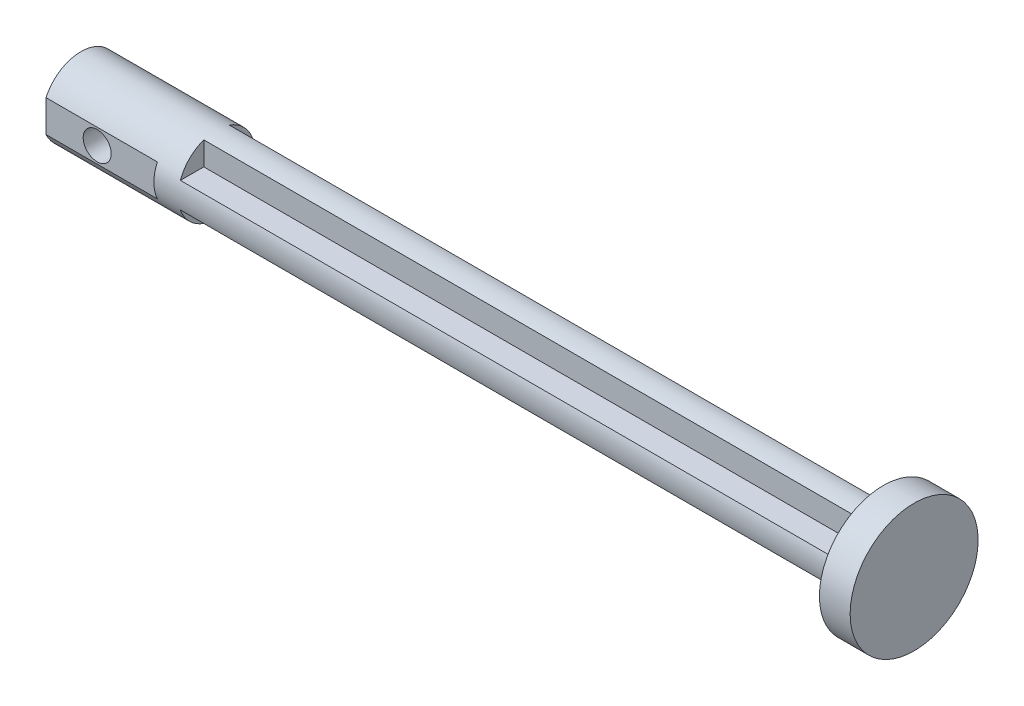
ISO-10303-21;
HEADER;
FILE_DESCRIPTION(('STEP AP214'),'2;1');
FILE_NAME('part.step','',(''),(''),'','','');
FILE_SCHEMA(('AUTOMOTIVE_DESIGN { 1 0 10303 214 1 1 1 1 }'));
ENDSEC;
DATA;
#1=APPLICATION_CONTEXT('core data for automotive mechanical design processes');
#2=APPLICATION_PROTOCOL_DEFINITION('international standard','automotive_design',2000,#1);
#3=PRODUCT_CONTEXT('',#1,'mechanical');
#4=PRODUCT('Part','Part','',(#3));
#5=PRODUCT_RELATED_PRODUCT_CATEGORY('part','',(#4));
#6=PRODUCT_DEFINITION_FORMATION('','',#4);
#7=PRODUCT_DEFINITION_CONTEXT('part definition',#1,'design');
#8=PRODUCT_DEFINITION('design','',#6,#7);
#9=PRODUCT_DEFINITION_SHAPE('','',#8);
#10=(LENGTH_UNIT() NAMED_UNIT(*) SI_UNIT(.MILLI.,.METRE.));
#11=(NAMED_UNIT(*) PLANE_ANGLE_UNIT() SI_UNIT($,.RADIAN.));
#12=(NAMED_UNIT(*) SI_UNIT($,.STERADIAN.) SOLID_ANGLE_UNIT());
#13=UNCERTAINTY_MEASURE_WITH_UNIT(LENGTH_MEASURE(1.E-05),#10,'distance_accuracy_value','');
#14=(GEOMETRIC_REPRESENTATION_CONTEXT(3) GLOBAL_UNCERTAINTY_ASSIGNED_CONTEXT((#13)) GLOBAL_UNIT_ASSIGNED_CONTEXT((#10,
#11,#12)) REPRESENTATION_CONTEXT('',''));
#15=CARTESIAN_POINT('',(0.,0.,0.));
#16=DIRECTION('',(0.,0.,1.));
#17=DIRECTION('',(1.,0.,0.));
#18=AXIS2_PLACEMENT_3D('',#15,#16,#17);
#19=CARTESIAN_POINT('',(13.462,0.,0.));
#20=DIRECTION('',(1.,0.,0.));
#21=DIRECTION('',(0.,0.,-1.));
#22=AXIS2_PLACEMENT_3D('',#19,#20,#21);
#23=PLANE('',#22);
#24=DIRECTION('',(0.,1.,0.));
#25=VECTOR('',#24,1.);
#26=CARTESIAN_POINT('',(13.462,1.27,-1.27));
#27=LINE('',#26,#25);
#28=CARTESIAN_POINT('',(13.462,1.27,-1.27));
#29=VERTEX_POINT('',#28);
#30=CARTESIAN_POINT('',(13.462,3.59210244842766,-1.27));
#31=VERTEX_POINT('',#30);
#32=EDGE_CURVE('E57',#29,#31,#27,.T.);
#33=ORIENTED_EDGE('',*,*,#32,.F.);
#34=DIRECTION('',(0.,0.,1.));
#35=VECTOR('',#34,1.);
#36=CARTESIAN_POINT('',(13.462,1.27,-3.59210244842766));
#37=LINE('',#36,#35);
#38=CARTESIAN_POINT('',(13.462,1.27,-3.59210244842766));
#39=VERTEX_POINT('',#38);
#40=EDGE_CURVE('E171',#39,#29,#37,.T.);
#41=ORIENTED_EDGE('',*,*,#40,.F.);
#42=CARTESIAN_POINT('',(13.462,0.,0.));
#43=DIRECTION('',(1.,0.,0.));
#44=DIRECTION('',(0.,0.,-1.));
#45=AXIS2_PLACEMENT_3D('',#42,#43,#44);
#46=CIRCLE('',#45,3.81);
#47=EDGE_CURVE('E11',#39,#31,#46,.T.);
#48=ORIENTED_EDGE('',*,*,#47,.T.);
#49=EDGE_LOOP('',(#33,#41,#48));
#50=FACE_BOUND('',#49,.T.);
#51=ADVANCED_FACE('F32',(#50),#23,.T.);
#52=DIRECTION('',(0.,0.,-1.));
#53=VECTOR('',#52,1.);
#54=CARTESIAN_POINT('',(13.462,-1.27,-1.27));
#55=LINE('',#54,#53);
#56=CARTESIAN_POINT('',(13.462,-1.27,-1.27));
#57=VERTEX_POINT('',#56);
#58=CARTESIAN_POINT('',(13.462,-1.27,-3.59210244842766));
#59=VERTEX_POINT('',#58);
#60=EDGE_CURVE('E184',#57,#59,#55,.T.);
#61=ORIENTED_EDGE('',*,*,#60,.F.);
#62=DIRECTION('',(0.,1.,0.));
#63=VECTOR('',#62,1.);
#64=CARTESIAN_POINT('',(13.462,-3.59210244842766,-1.27));
#65=LINE('',#64,#63);
#66=CARTESIAN_POINT('',(13.462,-3.59210244842766,-1.27));
#67=VERTEX_POINT('',#66);
#68=EDGE_CURVE('E190',#67,#57,#65,.T.);
#69=ORIENTED_EDGE('',*,*,#68,.F.);
#70=EDGE_CURVE('E258',#67,#59,#46,.T.);
#71=ORIENTED_EDGE('',*,*,#70,.T.);
#72=EDGE_LOOP('',(#61,#69,#71));
#73=FACE_BOUND('',#72,.T.);
#74=ADVANCED_FACE('F289',(#73),#23,.T.);
#75=DIRECTION('',(0.,-1.,0.));
#76=VECTOR('',#75,1.);
#77=CARTESIAN_POINT('',(13.462,-1.27,1.27));
#78=LINE('',#77,#76);
#79=CARTESIAN_POINT('',(13.462,-1.27,1.27));
#80=VERTEX_POINT('',#79);
#81=CARTESIAN_POINT('',(13.462,-3.59210244842766,1.27));
#82=VERTEX_POINT('',#81);
#83=EDGE_CURVE('E203',#80,#82,#78,.T.);
#84=ORIENTED_EDGE('',*,*,#83,.F.);
#85=DIRECTION('',(0.,0.,-1.));
#86=VECTOR('',#85,1.);
#87=CARTESIAN_POINT('',(13.462,-1.27,3.59210244842766));
#88=LINE('',#87,#86);
#89=CARTESIAN_POINT('',(13.462,-1.27,3.59210244842766));
#90=VERTEX_POINT('',#89);
#91=EDGE_CURVE('E209',#90,#80,#88,.T.);
#92=ORIENTED_EDGE('',*,*,#91,.F.);
#93=EDGE_CURVE('E267',#90,#82,#46,.T.);
#94=ORIENTED_EDGE('',*,*,#93,.T.);
#95=EDGE_LOOP('',(#84,#92,#94));
#96=FACE_BOUND('',#95,.T.);
#97=ADVANCED_FACE('F295',(#96),#23,.T.);
#98=CARTESIAN_POINT('',(13.462,0.,0.));
#99=DIRECTION('',(-1.,0.,0.));
#100=DIRECTION('',(0.,0.,1.));
#101=AXIS2_PLACEMENT_3D('',#98,#99,#100);
#102=CYLINDRICAL_SURFACE('',#101,3.81);
#103=ORIENTED_EDGE('',*,*,#47,.F.);
#104=DIRECTION('',(-1.,0.,0.));
#105=VECTOR('',#104,1.);
#106=CARTESIAN_POINT('',(90.405307345283,1.27,-3.59210244842766));
#107=LINE('',#106,#105);
#108=CARTESIAN_POINT('',(79.629,1.27,-3.59210244842766));
#109=VERTEX_POINT('',#108);
#110=EDGE_CURVE('E174',#109,#39,#107,.T.);
#111=ORIENTED_EDGE('',*,*,#110,.F.);
#112=CARTESIAN_POINT('',(79.629,0.,0.));
#113=DIRECTION('',(1.,0.,0.));
#114=DIRECTION('',(0.,0.,-1.));
#115=AXIS2_PLACEMENT_3D('',#112,#113,#114);
#116=CIRCLE('',#115,3.81);
#117=CARTESIAN_POINT('',(79.629,-1.27,-3.59210244842766));
#118=VERTEX_POINT('',#117);
#119=EDGE_CURVE('E217',#118,#109,#116,.T.);
#120=ORIENTED_EDGE('',*,*,#119,.F.);
#121=DIRECTION('',(-1.,0.,0.));
#122=VECTOR('',#121,1.);
#123=CARTESIAN_POINT('',(90.405307345283,-1.27,-3.59210244842766));
#124=LINE('',#123,#122);
#125=EDGE_CURVE('E179',#118,#59,#124,.T.);
#126=ORIENTED_EDGE('',*,*,#125,.T.);
#127=ORIENTED_EDGE('',*,*,#70,.F.);
#128=DIRECTION('',(-1.,0.,0.));
#129=VECTOR('',#128,1.);
#130=CARTESIAN_POINT('',(90.405307345283,-3.59210244842766,-1.27));
#131=LINE('',#130,#129);
#132=CARTESIAN_POINT('',(79.629,-3.59210244842766,-1.27));
#133=VERTEX_POINT('',#132);
#134=EDGE_CURVE('E193',#133,#67,#131,.T.);
#135=ORIENTED_EDGE('',*,*,#134,.F.);
#136=CARTESIAN_POINT('',(79.629,0.,0.));
#137=DIRECTION('',(1.,0.,0.));
#138=DIRECTION('',(0.,0.,-1.));
#139=AXIS2_PLACEMENT_3D('',#136,#137,#138);
#140=CIRCLE('',#139,3.81);
#141=CARTESIAN_POINT('',(79.629,-3.59210244842766,1.27));
#142=VERTEX_POINT('',#141);
#143=EDGE_CURVE('E226',#142,#133,#140,.T.);
#144=ORIENTED_EDGE('',*,*,#143,.F.);
#145=DIRECTION('',(-1.,0.,0.));
#146=VECTOR('',#145,1.);
#147=CARTESIAN_POINT('',(90.405307345283,-3.59210244842766,1.27));
#148=LINE('',#147,#146);
#149=EDGE_CURVE('E198',#142,#82,#148,.T.);
#150=ORIENTED_EDGE('',*,*,#149,.T.);
#151=ORIENTED_EDGE('',*,*,#93,.F.);
#152=DIRECTION('',(-1.,0.,0.));
#153=VECTOR('',#152,1.);
#154=CARTESIAN_POINT('',(90.405307345283,-1.27,3.59210244842766));
#155=LINE('',#154,#153);
#156=CARTESIAN_POINT('',(79.629,-1.27,3.59210244842766));
#157=VERTEX_POINT('',#156);
#158=EDGE_CURVE('E321',#157,#90,#155,.T.);
#159=ORIENTED_EDGE('',*,*,#158,.F.);
#160=CARTESIAN_POINT('',(79.629,0.,0.));
#161=DIRECTION('',(1.,0.,0.));
#162=DIRECTION('',(0.,0.,-1.));
#163=AXIS2_PLACEMENT_3D('',#160,#161,#162);
#164=CIRCLE('',#163,3.81);
#165=CARTESIAN_POINT('',(79.629,1.27,3.59210244842766));
#166=VERTEX_POINT('',#165);
#167=EDGE_CURVE('E235',#166,#157,#164,.T.);
#168=ORIENTED_EDGE('',*,*,#167,.F.);
#169=DIRECTION('',(-1.,0.,0.));
#170=VECTOR('',#169,1.);
#171=CARTESIAN_POINT('',(90.405307345283,1.27,3.59210244842766));
#172=LINE('',#171,#170);
#173=CARTESIAN_POINT('',(13.462,1.27,3.59210244842766));
#174=VERTEX_POINT('',#173);
#175=EDGE_CURVE('E322',#166,#174,#172,.T.);
#176=ORIENTED_EDGE('',*,*,#175,.T.);
#177=CARTESIAN_POINT('',(13.462,3.59210244842766,1.27));
#178=VERTEX_POINT('',#177);
#179=EDGE_CURVE('E42',#178,#174,#46,.T.);
#180=ORIENTED_EDGE('',*,*,#179,.F.);
#181=DIRECTION('',(-1.,0.,0.));
#182=VECTOR('',#181,1.);
#183=CARTESIAN_POINT('',(90.405307345283,3.59210244842766,1.27));
#184=LINE('',#183,#182);
#185=CARTESIAN_POINT('',(79.629,3.59210244842766,1.27));
#186=VERTEX_POINT('',#185);
#187=EDGE_CURVE('E271',#186,#178,#184,.T.);
#188=ORIENTED_EDGE('',*,*,#187,.F.);
#189=CARTESIAN_POINT('',(79.629,0.,0.));
#190=DIRECTION('',(1.,0.,0.));
#191=DIRECTION('',(0.,0.,-1.));
#192=AXIS2_PLACEMENT_3D('',#189,#190,#191);
#193=CIRCLE('',#192,3.81);
#194=CARTESIAN_POINT('',(79.629,3.59210244842766,-1.27));
#195=VERTEX_POINT('',#194);
#196=EDGE_CURVE('E244',#195,#186,#193,.T.);
#197=ORIENTED_EDGE('',*,*,#196,.F.);
#198=DIRECTION('',(-1.,0.,0.));
#199=VECTOR('',#198,1.);
#200=CARTESIAN_POINT('',(90.405307345283,3.59210244842766,-1.27));
#201=LINE('',#200,#199);
#202=EDGE_CURVE('E157',#195,#31,#201,.T.);
#203=ORIENTED_EDGE('',*,*,#202,.T.);
#204=EDGE_LOOP('',(#103,#111,#120,#126,#127,#135,#144,#150,#151,#159,#168,#176,#180,#188,#197,#203));
#205=FACE_BOUND('',#204,.T.);
#206=CARTESIAN_POINT('',(11.049,0.,0.));
#207=DIRECTION('',(-1.,0.,0.));
#208=DIRECTION('',(0.,0.,1.));
#209=AXIS2_PLACEMENT_3D('',#206,#207,#208);
#210=CIRCLE('',#209,3.81);
#211=CARTESIAN_POINT('',(11.049,-1.5875,3.46351609639684));
#212=VERTEX_POINT('',#211);
#213=CARTESIAN_POINT('',(11.049,1.5875,3.46351609639684));
#214=VERTEX_POINT('',#213);
#215=EDGE_CURVE('E136',#212,#214,#210,.T.);
#216=ORIENTED_EDGE('',*,*,#215,.F.);
#217=DIRECTION('',(-1.,0.,0.));
#218=VECTOR('',#217,1.);
#219=CARTESIAN_POINT('',(11.049,-1.5875,3.46351609639684));
#220=LINE('',#219,#218);
#221=CARTESIAN_POINT('',(0.,-1.5875,3.46351609639684));
#222=VERTEX_POINT('',#221);
#223=EDGE_CURVE('E144',#212,#222,#220,.T.);
#224=ORIENTED_EDGE('',*,*,#223,.T.);
#225=CARTESIAN_POINT('',(0.,0.,0.));
#226=DIRECTION('',(1.,0.,0.));
#227=DIRECTION('',(0.,0.,-1.));
#228=AXIS2_PLACEMENT_3D('',#225,#226,#227);
#229=CIRCLE('',#228,3.81);
#230=CARTESIAN_POINT('',(0.,1.5875,3.46351609639684));
#231=VERTEX_POINT('',#230);
#232=EDGE_CURVE('E148',#222,#231,#229,.T.);
#233=ORIENTED_EDGE('',*,*,#232,.T.);
#234=DIRECTION('',(-1.,0.,0.));
#235=VECTOR('',#234,1.);
#236=CARTESIAN_POINT('',(11.049,1.5875,3.46351609639684));
#237=LINE('',#236,#235);
#238=EDGE_CURVE('E50',#214,#231,#237,.T.);
#239=ORIENTED_EDGE('',*,*,#238,.F.);
#240=EDGE_LOOP('',(#216,#224,#233,#239));
#241=FACE_BOUND('',#240,.T.);
#242=ADVANCED_FACE('F34',(#205,#241),#102,.T.);
#243=DIRECTION('',(0.,0.,1.));
#244=VECTOR('',#243,1.);
#245=CARTESIAN_POINT('',(13.462,1.27,1.27));
#246=LINE('',#245,#244);
#247=CARTESIAN_POINT('',(13.462,1.27,1.27));
#248=VERTEX_POINT('',#247);
#249=EDGE_CURVE('E36',#248,#174,#246,.T.);
#250=ORIENTED_EDGE('',*,*,#249,.F.);
#251=DIRECTION('',(0.,-1.,0.));
#252=VECTOR('',#251,1.);
#253=CARTESIAN_POINT('',(13.462,3.59210244842766,1.27));
#254=LINE('',#253,#252);
#255=EDGE_CURVE('E252',#178,#248,#254,.T.);
#256=ORIENTED_EDGE('',*,*,#255,.F.);
#257=ORIENTED_EDGE('',*,*,#179,.T.);
#258=EDGE_LOOP('',(#250,#256,#257));
#259=FACE_BOUND('',#258,.T.);
#260=ADVANCED_FACE('F291',(#259),#23,.T.);
#261=CARTESIAN_POINT('',(0.,0.,0.));
#262=DIRECTION('',(1.,0.,0.));
#263=DIRECTION('',(0.,0.,-1.));
#264=AXIS2_PLACEMENT_3D('',#261,#262,#263);
#265=PLANE('',#264);
#266=ORIENTED_EDGE('',*,*,#232,.F.);
#267=DIRECTION('',(0.,-1.,0.));
#268=VECTOR('',#267,1.);
#269=CARTESIAN_POINT('',(0.,1.5875,3.46351609639684));
#270=LINE('',#269,#268);
#271=EDGE_CURVE('E141',#231,#222,#270,.T.);
#272=ORIENTED_EDGE('',*,*,#271,.F.);
#273=EDGE_LOOP('',(#266,#272));
#274=FACE_BOUND('',#273,.T.);
#275=ADVANCED_FACE('F299',(#274),#265,.F.);
#276=CARTESIAN_POINT('',(90.405307345283,3.59210244842766,1.27));
#277=DIRECTION('',(0.,0.,-1.));
#278=DIRECTION('',(0.,1.,0.));
#279=AXIS2_PLACEMENT_3D('',#276,#277,#278);
#280=PLANE('',#279);
#281=DIRECTION('',(0.,-1.,0.));
#282=VECTOR('',#281,1.);
#283=CARTESIAN_POINT('',(79.629,3.59210244842766,1.27));
#284=LINE('',#283,#282);
#285=CARTESIAN_POINT('',(79.629,1.27,1.27));
#286=VERTEX_POINT('',#285);
#287=EDGE_CURVE('E241',#186,#286,#284,.T.);
#288=ORIENTED_EDGE('',*,*,#287,.F.);
#289=ORIENTED_EDGE('',*,*,#187,.T.);
#290=ORIENTED_EDGE('',*,*,#255,.T.);
#291=DIRECTION('',(-1.,0.,0.));
#292=VECTOR('',#291,1.);
#293=CARTESIAN_POINT('',(90.405307345283,1.27,1.27));
#294=LINE('',#293,#292);
#295=EDGE_CURVE('E249',#286,#248,#294,.T.);
#296=ORIENTED_EDGE('',*,*,#295,.F.);
#297=EDGE_LOOP('',(#288,#289,#290,#296));
#298=FACE_BOUND('',#297,.T.);
#299=ADVANCED_FACE('F305',(#298),#280,.F.);
#300=CARTESIAN_POINT('',(90.405307345283,1.27,1.27));
#301=DIRECTION('',(0.,-1.,0.));
#302=DIRECTION('',(0.,0.,-1.));
#303=AXIS2_PLACEMENT_3D('',#300,#301,#302);
#304=PLANE('',#303);
#305=DIRECTION('',(0.,0.,1.));
#306=VECTOR('',#305,1.);
#307=CARTESIAN_POINT('',(79.629,1.27,1.27));
#308=LINE('',#307,#306);
#309=EDGE_CURVE('E238',#286,#166,#308,.T.);
#310=ORIENTED_EDGE('',*,*,#309,.F.);
#311=ORIENTED_EDGE('',*,*,#295,.T.);
#312=ORIENTED_EDGE('',*,*,#249,.T.);
#313=ORIENTED_EDGE('',*,*,#175,.F.);
#314=EDGE_LOOP('',(#310,#311,#312,#313));
#315=FACE_BOUND('',#314,.T.);
#316=ADVANCED_FACE('F334',(#315),#304,.F.);
#317=CARTESIAN_POINT('',(90.405307345283,-1.27,3.59210244842766));
#318=DIRECTION('',(0.,1.,0.));
#319=DIRECTION('',(0.,0.,1.));
#320=AXIS2_PLACEMENT_3D('',#317,#318,#319);
#321=PLANE('',#320);
#322=DIRECTION('',(0.,0.,-1.));
#323=VECTOR('',#322,1.);
#324=CARTESIAN_POINT('',(79.629,-1.27,3.59210244842766));
#325=LINE('',#324,#323);
#326=CARTESIAN_POINT('',(79.629,-1.27,1.27));
#327=VERTEX_POINT('',#326);
#328=EDGE_CURVE('E232',#157,#327,#325,.T.);
#329=ORIENTED_EDGE('',*,*,#328,.F.);
#330=ORIENTED_EDGE('',*,*,#158,.T.);
#331=ORIENTED_EDGE('',*,*,#91,.T.);
#332=DIRECTION('',(-1.,0.,0.));
#333=VECTOR('',#332,1.);
#334=CARTESIAN_POINT('',(90.405307345283,-1.27,1.27));
#335=LINE('',#334,#333);
#336=EDGE_CURVE('E208',#327,#80,#335,.T.);
#337=ORIENTED_EDGE('',*,*,#336,.F.);
#338=EDGE_LOOP('',(#329,#330,#331,#337));
#339=FACE_BOUND('',#338,.T.);
#340=ADVANCED_FACE('F319',(#339),#321,.F.);
#341=CARTESIAN_POINT('',(90.405307345283,-1.27,1.27));
#342=DIRECTION('',(0.,0.,-1.));
#343=DIRECTION('',(0.,1.,0.));
#344=AXIS2_PLACEMENT_3D('',#341,#342,#343);
#345=PLANE('',#344);
#346=DIRECTION('',(0.,-1.,0.));
#347=VECTOR('',#346,1.);
#348=CARTESIAN_POINT('',(79.629,-1.27,1.27));
#349=LINE('',#348,#347);
#350=EDGE_CURVE('E229',#327,#142,#349,.T.);
#351=ORIENTED_EDGE('',*,*,#350,.F.);
#352=ORIENTED_EDGE('',*,*,#336,.T.);
#353=ORIENTED_EDGE('',*,*,#83,.T.);
#354=ORIENTED_EDGE('',*,*,#149,.F.);
#355=EDGE_LOOP('',(#351,#352,#353,#354));
#356=FACE_BOUND('',#355,.T.);
#357=ADVANCED_FACE('F316',(#356),#345,.F.);
#358=CARTESIAN_POINT('',(90.405307345283,-3.59210244842766,-1.27));
#359=DIRECTION('',(0.,0.,1.));
#360=DIRECTION('',(0.,-1.,0.));
#361=AXIS2_PLACEMENT_3D('',#358,#359,#360);
#362=PLANE('',#361);
#363=DIRECTION('',(0.,1.,0.));
#364=VECTOR('',#363,1.);
#365=CARTESIAN_POINT('',(79.629,-3.59210244842766,-1.27));
#366=LINE('',#365,#364);
#367=CARTESIAN_POINT('',(79.629,-1.27,-1.27));
#368=VERTEX_POINT('',#367);
#369=EDGE_CURVE('E223',#133,#368,#366,.T.);
#370=ORIENTED_EDGE('',*,*,#369,.F.);
#371=ORIENTED_EDGE('',*,*,#134,.T.);
#372=ORIENTED_EDGE('',*,*,#68,.T.);
#373=DIRECTION('',(-1.,0.,0.));
#374=VECTOR('',#373,1.);
#375=CARTESIAN_POINT('',(90.405307345283,-1.27,-1.27));
#376=LINE('',#375,#374);
#377=EDGE_CURVE('E189',#368,#57,#376,.T.);
#378=ORIENTED_EDGE('',*,*,#377,.F.);
#379=EDGE_LOOP('',(#370,#371,#372,#378));
#380=FACE_BOUND('',#379,.T.);
#381=ADVANCED_FACE('F346',(#380),#362,.F.);
#382=CARTESIAN_POINT('',(90.405307345283,-1.27,-1.27));
#383=DIRECTION('',(0.,1.,0.));
#384=DIRECTION('',(0.,0.,1.));
#385=AXIS2_PLACEMENT_3D('',#382,#383,#384);
#386=PLANE('',#385);
#387=DIRECTION('',(0.,0.,-1.));
#388=VECTOR('',#387,1.);
#389=CARTESIAN_POINT('',(79.629,-1.27,-1.27));
#390=LINE('',#389,#388);
#391=EDGE_CURVE('E220',#368,#118,#390,.T.);
#392=ORIENTED_EDGE('',*,*,#391,.F.);
#393=ORIENTED_EDGE('',*,*,#377,.T.);
#394=ORIENTED_EDGE('',*,*,#60,.T.);
#395=ORIENTED_EDGE('',*,*,#125,.F.);
#396=EDGE_LOOP('',(#392,#393,#394,#395));
#397=FACE_BOUND('',#396,.T.);
#398=ADVANCED_FACE('F342',(#397),#386,.F.);
#399=CARTESIAN_POINT('',(90.405307345283,1.27,-3.59210244842766));
#400=DIRECTION('',(0.,-1.,0.));
#401=DIRECTION('',(0.,0.,-1.));
#402=AXIS2_PLACEMENT_3D('',#399,#400,#401);
#403=PLANE('',#402);
#404=DIRECTION('',(0.,0.,1.));
#405=VECTOR('',#404,1.);
#406=CARTESIAN_POINT('',(79.629,1.27,-3.59210244842766));
#407=LINE('',#406,#405);
#408=CARTESIAN_POINT('',(79.629,1.27,-1.27));
#409=VERTEX_POINT('',#408);
#410=EDGE_CURVE('E214',#109,#409,#407,.T.);
#411=ORIENTED_EDGE('',*,*,#410,.F.);
#412=ORIENTED_EDGE('',*,*,#110,.T.);
#413=ORIENTED_EDGE('',*,*,#40,.T.);
#414=DIRECTION('',(-1.,0.,0.));
#415=VECTOR('',#414,1.);
#416=CARTESIAN_POINT('',(90.405307345283,1.27,-1.27));
#417=LINE('',#416,#415);
#418=EDGE_CURVE('E168',#409,#29,#417,.T.);
#419=ORIENTED_EDGE('',*,*,#418,.F.);
#420=EDGE_LOOP('',(#411,#412,#413,#419));
#421=FACE_BOUND('',#420,.T.);
#422=ADVANCED_FACE('F287',(#421),#403,.F.);
#423=CARTESIAN_POINT('',(90.405307345283,1.27,-1.27));
#424=DIRECTION('',(0.,0.,1.));
#425=DIRECTION('',(0.,-1.,0.));
#426=AXIS2_PLACEMENT_3D('',#423,#424,#425);
#427=PLANE('',#426);
#428=DIRECTION('',(0.,1.,0.));
#429=VECTOR('',#428,1.);
#430=CARTESIAN_POINT('',(79.629,1.27,-1.27));
#431=LINE('',#430,#429);
#432=EDGE_CURVE('E167',#409,#195,#431,.T.);
#433=ORIENTED_EDGE('',*,*,#432,.F.);
#434=ORIENTED_EDGE('',*,*,#418,.T.);
#435=ORIENTED_EDGE('',*,*,#32,.T.);
#436=ORIENTED_EDGE('',*,*,#202,.F.);
#437=EDGE_LOOP('',(#433,#434,#435,#436));
#438=FACE_BOUND('',#437,.T.);
#439=ADVANCED_FACE('F285',(#438),#427,.F.);
#440=CARTESIAN_POINT('',(79.629,0.,0.));
#441=DIRECTION('',(1.,0.,0.));
#442=DIRECTION('',(0.,0.,-1.));
#443=AXIS2_PLACEMENT_3D('',#440,#441,#442);
#444=PLANE('',#443);
#445=CARTESIAN_POINT('',(79.629,0.,0.));
#446=DIRECTION('',(1.,0.,0.));
#447=DIRECTION('',(0.,0.,-1.));
#448=AXIS2_PLACEMENT_3D('',#445,#446,#447);
#449=CIRCLE('',#448,6.35);
#450=CARTESIAN_POINT('',(79.629,0.,6.35));
#451=VERTEX_POINT('',#450);
#452=EDGE_CURVE('E150',#451,#451,#449,.T.);
#453=ORIENTED_EDGE('',*,*,#452,.F.);
#454=EDGE_LOOP('',(#453));
#455=FACE_BOUND('',#454,.T.);
#456=ORIENTED_EDGE('',*,*,#309,.T.);
#457=ORIENTED_EDGE('',*,*,#167,.T.);
#458=ORIENTED_EDGE('',*,*,#328,.T.);
#459=ORIENTED_EDGE('',*,*,#350,.T.);
#460=ORIENTED_EDGE('',*,*,#143,.T.);
#461=ORIENTED_EDGE('',*,*,#369,.T.);
#462=ORIENTED_EDGE('',*,*,#391,.T.);
#463=ORIENTED_EDGE('',*,*,#119,.T.);
#464=ORIENTED_EDGE('',*,*,#410,.T.);
#465=ORIENTED_EDGE('',*,*,#432,.T.);
#466=ORIENTED_EDGE('',*,*,#196,.T.);
#467=ORIENTED_EDGE('',*,*,#287,.T.);
#468=EDGE_LOOP('',(#456,#457,#458,#459,#460,#461,#462,#463,#464,#465,#466,#467));
#469=FACE_BOUND('',#468,.T.);
#470=ADVANCED_FACE('F338',(#455,#469),#444,.F.);
#471=CARTESIAN_POINT('',(82.677,0.,0.));
#472=DIRECTION('',(-1.,0.,0.));
#473=DIRECTION('',(0.,0.,1.));
#474=AXIS2_PLACEMENT_3D('',#471,#472,#473);
#475=CYLINDRICAL_SURFACE('',#474,6.35);
#476=CARTESIAN_POINT('',(82.677,0.,0.));
#477=DIRECTION('',(1.,0.,0.));
#478=DIRECTION('',(0.,0.,-1.));
#479=AXIS2_PLACEMENT_3D('',#476,#477,#478);
#480=CIRCLE('',#479,6.35);
#481=CARTESIAN_POINT('',(82.677,0.,6.35));
#482=VERTEX_POINT('',#481);
#483=EDGE_CURVE('E154',#482,#482,#480,.T.);
#484=CARTESIAN_POINT('',(82.677,0.,6.35));
#485=CARTESIAN_POINT('',(82.64525,0.,6.35));
#486=CARTESIAN_POINT('',(82.6135,0.,6.35));
#487=CARTESIAN_POINT('',(82.55,0.,6.35));
#488=CARTESIAN_POINT('',(82.51825,0.,6.35));
#489=CARTESIAN_POINT('',(82.45475,0.,6.35));
#490=CARTESIAN_POINT('',(82.423,0.,6.35));
#491=CARTESIAN_POINT('',(82.3595,0.,6.35));
#492=CARTESIAN_POINT('',(82.32775,0.,6.35));
#493=CARTESIAN_POINT('',(82.26425,0.,6.35));
#494=CARTESIAN_POINT('',(82.2325,0.,6.35));
#495=CARTESIAN_POINT('',(82.169,0.,6.35));
#496=CARTESIAN_POINT('',(82.13725,0.,6.35));
#497=CARTESIAN_POINT('',(82.07375,0.,6.35));
#498=CARTESIAN_POINT('',(82.042,0.,6.35));
#499=CARTESIAN_POINT('',(81.9785,0.,6.35));
#500=CARTESIAN_POINT('',(81.94675,0.,6.35));
#501=CARTESIAN_POINT('',(81.88325,0.,6.35));
#502=CARTESIAN_POINT('',(81.8515,0.,6.35));
#503=CARTESIAN_POINT('',(81.788,0.,6.35));
#504=CARTESIAN_POINT('',(81.75625,0.,6.35));
#505=CARTESIAN_POINT('',(81.69275,0.,6.35));
#506=CARTESIAN_POINT('',(81.661,0.,6.35));
#507=CARTESIAN_POINT('',(81.5975,0.,6.35));
#508=CARTESIAN_POINT('',(81.56575,0.,6.35));
#509=CARTESIAN_POINT('',(81.50225,0.,6.35));
#510=CARTESIAN_POINT('',(81.4705,0.,6.35));
#511=CARTESIAN_POINT('',(81.407,0.,6.35));
#512=CARTESIAN_POINT('',(81.37525,0.,6.35));
#513=CARTESIAN_POINT('',(81.31175,0.,6.35));
#514=CARTESIAN_POINT('',(81.28,0.,6.35));
#515=CARTESIAN_POINT('',(81.2165,0.,6.35));
#516=CARTESIAN_POINT('',(81.18475,0.,6.35));
#517=CARTESIAN_POINT('',(81.12125,0.,6.35));
#518=CARTESIAN_POINT('',(81.0895,0.,6.35));
#519=CARTESIAN_POINT('',(81.026,0.,6.35));
#520=CARTESIAN_POINT('',(80.99425,0.,6.35));
#521=CARTESIAN_POINT('',(80.93075,0.,6.35));
#522=CARTESIAN_POINT('',(80.899,0.,6.35));
#523=CARTESIAN_POINT('',(80.8355,0.,6.35));
#524=CARTESIAN_POINT('',(80.80375,0.,6.35));
#525=CARTESIAN_POINT('',(80.74025,0.,6.35));
#526=CARTESIAN_POINT('',(80.7085,0.,6.35));
#527=CARTESIAN_POINT('',(80.645,0.,6.35));
#528=CARTESIAN_POINT('',(80.61325,0.,6.35));
#529=CARTESIAN_POINT('',(80.54975,0.,6.35));
#530=CARTESIAN_POINT('',(80.518,0.,6.35));
#531=CARTESIAN_POINT('',(80.4545,0.,6.35));
#532=CARTESIAN_POINT('',(80.42275,0.,6.35));
#533=CARTESIAN_POINT('',(80.35925,0.,6.35));
#534=CARTESIAN_POINT('',(80.3275,0.,6.35));
#535=CARTESIAN_POINT('',(80.264,0.,6.35));
#536=CARTESIAN_POINT('',(80.23225,0.,6.35));
#537=CARTESIAN_POINT('',(80.16875,0.,6.35));
#538=CARTESIAN_POINT('',(80.137,0.,6.35));
#539=CARTESIAN_POINT('',(80.0735,0.,6.35));
#540=CARTESIAN_POINT('',(80.04175,0.,6.35));
#541=CARTESIAN_POINT('',(79.97825,0.,6.35));
#542=CARTESIAN_POINT('',(79.9465,0.,6.35));
#543=CARTESIAN_POINT('',(79.883,0.,6.35));
#544=CARTESIAN_POINT('',(79.85125,0.,6.35));
#545=CARTESIAN_POINT('',(79.78775,0.,6.35));
#546=CARTESIAN_POINT('',(79.756,0.,6.35));
#547=CARTESIAN_POINT('',(79.6925,0.,6.35));
#548=CARTESIAN_POINT('',(79.66075,0.,6.35));
#549=CARTESIAN_POINT('',(79.629,0.,6.35));
#550=B_SPLINE_CURVE_WITH_KNOTS('',3,(#484,#485,#486,#487,#488,#489,#490,#491,#492,#493,#494,
#495,#496,#497,#498,#499,#500,#501,#502,#503,#504,#505,#506,#507,#508,#509,#510,#511,#512,#513,
#514,#515,#516,#517,#518,#519,#520,#521,#522,#523,#524,#525,#526,#527,#528,#529,#530,#531,#532,
#533,#534,#535,#536,#537,#538,#539,#540,#541,#542,#543,#544,#545,#546,#547,#548,#549),
.UNSPECIFIED.,.F.,.F.,(4,2,2,2,2,2,2,2,2,2,2,2,2,2,2,2,2,2,2,2,2,2,2,2,2,2,2,2,2,2,2,2,4),(0.,
0.0952499999999912,0.190499999999996,0.285749999999987,0.380999999999992,0.476249999999998,
0.571499999999989,0.666749999999994,0.761999999999999,0.85724999999999,0.952499999999995,
1.04774999999999,1.14299999999999,1.23825,1.33349999999999,1.42874999999999,1.524,
1.61924999999999,1.71449999999999,1.80974999999999,1.90499999999999,2.00024999999999,
2.09549999999999,2.19074999999999,2.286,2.38124999999999,2.47649999999999,2.57174999999998,
2.66699999999999,2.76224999999999,2.85749999999998,2.95274999999999,3.048),.UNSPECIFIED.);
#551=EDGE_CURVE('BSEAM411',#482,#451,#550,.T.);
#552=ORIENTED_EDGE('',*,*,#483,.F.);
#553=ORIENTED_EDGE('',*,*,#452,.T.);
#554=ORIENTED_EDGE('',*,*,#551,.T.);
#555=ORIENTED_EDGE('',*,*,#551,.F.);
#556=EDGE_LOOP('',(#552,#554,#553,#555));
#557=FACE_BOUND('',#556,.T.);
#558=ADVANCED_FACE('F411',(#557),#475,.T.);
#559=CARTESIAN_POINT('',(82.677,0.,0.));
#560=DIRECTION('',(1.,0.,0.));
#561=DIRECTION('',(0.,0.,-1.));
#562=AXIS2_PLACEMENT_3D('',#559,#560,#561);
#563=PLANE('',#562);
#564=ORIENTED_EDGE('',*,*,#483,.T.);
#565=EDGE_LOOP('',(#564));
#566=FACE_BOUND('',#565,.T.);
#567=ADVANCED_FACE('F421',(#566),#563,.T.);
#568=CARTESIAN_POINT('',(11.049,1.5875,3.46351609639684));
#569=DIRECTION('',(0.,0.,-1.));
#570=DIRECTION('',(0.,1.,0.));
#571=AXIS2_PLACEMENT_3D('',#568,#569,#570);
#572=PLANE('',#571);
#573=CARTESIAN_POINT('',(5.08,0.,3.46351609639684));
#574=DIRECTION('',(0.,0.,1.));
#575=DIRECTION('',(1.,0.,0.));
#576=AXIS2_PLACEMENT_3D('',#573,#574,#575);
#577=CIRCLE('',#576,1.3890625);
#578=CARTESIAN_POINT('',(6.4690625,0.,3.46351609639684));
#579=VERTEX_POINT('',#578);
#580=EDGE_CURVE('E488',#579,#579,#577,.T.);
#581=ORIENTED_EDGE('',*,*,#580,.F.);
#582=EDGE_LOOP('',(#581));
#583=FACE_BOUND('',#582,.T.);
#584=ORIENTED_EDGE('',*,*,#271,.T.);
#585=ORIENTED_EDGE('',*,*,#223,.F.);
#586=DIRECTION('',(0.,-1.,0.));
#587=VECTOR('',#586,1.);
#588=CARTESIAN_POINT('',(11.049,1.5875,3.46351609639684));
#589=LINE('',#588,#587);
#590=EDGE_CURVE('E138',#214,#212,#589,.T.);
#591=ORIENTED_EDGE('',*,*,#590,.F.);
#592=ORIENTED_EDGE('',*,*,#238,.T.);
#593=EDGE_LOOP('',(#584,#585,#591,#592));
#594=FACE_BOUND('',#593,.T.);
#595=ADVANCED_FACE('F143',(#583,#594),#572,.F.);
#596=CARTESIAN_POINT('',(11.049,0.,0.));
#597=DIRECTION('',(-1.,0.,0.));
#598=DIRECTION('',(0.,0.,1.));
#599=AXIS2_PLACEMENT_3D('',#596,#597,#598);
#600=PLANE('',#599);
#601=ORIENTED_EDGE('',*,*,#215,.T.);
#602=ORIENTED_EDGE('',*,*,#590,.T.);
#603=EDGE_LOOP('',(#601,#602));
#604=FACE_BOUND('',#603,.T.);
#605=ADVANCED_FACE('F137',(#604),#600,.T.);
#606=CARTESIAN_POINT('',(5.08,0.,-0.346483903603161));
#607=DIRECTION('',(0.,0.,1.));
#608=DIRECTION('',(1.,0.,0.));
#609=AXIS2_PLACEMENT_3D('',#606,#607,#608);
#610=CYLINDRICAL_SURFACE('',#609,1.3890625);
#611=CARTESIAN_POINT('',(5.08,0.,-0.346483903603161));
#612=DIRECTION('',(0.,0.,1.));
#613=DIRECTION('',(1.,0.,0.));
#614=AXIS2_PLACEMENT_3D('',#611,#612,#613);
#615=CIRCLE('',#614,1.3890625);
#616=CARTESIAN_POINT('',(6.4690625,0.,-0.346483903603161));
#617=VERTEX_POINT('',#616);
#618=EDGE_CURVE('E487',#617,#617,#615,.T.);
#619=CARTESIAN_POINT('',(6.4690625,0.,-0.346483903603161));
#620=CARTESIAN_POINT('',(6.4690625,0.,-0.306796403603161));
#621=CARTESIAN_POINT('',(6.4690625,0.,-0.267108903603161));
#622=CARTESIAN_POINT('',(6.4690625,0.,-0.187733903603161));
#623=CARTESIAN_POINT('',(6.4690625,0.,-0.148046403603161));
#624=CARTESIAN_POINT('',(6.4690625,0.,-0.068671403603161));
#625=CARTESIAN_POINT('',(6.4690625,0.,-0.028983903603161));
#626=CARTESIAN_POINT('',(6.4690625,0.,0.050391096396839));
#627=CARTESIAN_POINT('',(6.4690625,0.,0.0900785963968391));
#628=CARTESIAN_POINT('',(6.4690625,0.,0.169453596396839));
#629=CARTESIAN_POINT('',(6.4690625,0.,0.209141096396839));
#630=CARTESIAN_POINT('',(6.4690625,0.,0.288516096396839));
#631=CARTESIAN_POINT('',(6.4690625,0.,0.328203596396839));
#632=CARTESIAN_POINT('',(6.4690625,0.,0.407578596396839));
#633=CARTESIAN_POINT('',(6.4690625,0.,0.447266096396839));
#634=CARTESIAN_POINT('',(6.4690625,0.,0.526641096396839));
#635=CARTESIAN_POINT('',(6.4690625,0.,0.566328596396839));
#636=CARTESIAN_POINT('',(6.4690625,0.,0.645703596396839));
#637=CARTESIAN_POINT('',(6.4690625,0.,0.685391096396839));
#638=CARTESIAN_POINT('',(6.4690625,0.,0.764766096396839));
#639=CARTESIAN_POINT('',(6.4690625,0.,0.804453596396839));
#640=CARTESIAN_POINT('',(6.4690625,0.,0.883828596396839));
#641=CARTESIAN_POINT('',(6.4690625,0.,0.923516096396839));
#642=CARTESIAN_POINT('',(6.4690625,0.,1.00289109639684));
#643=CARTESIAN_POINT('',(6.4690625,0.,1.04257859639684));
#644=CARTESIAN_POINT('',(6.4690625,0.,1.12195359639684));
#645=CARTESIAN_POINT('',(6.4690625,0.,1.16164109639684));
#646=CARTESIAN_POINT('',(6.4690625,0.,1.24101609639684));
#647=CARTESIAN_POINT('',(6.4690625,0.,1.28070359639684));
#648=CARTESIAN_POINT('',(6.4690625,0.,1.36007859639684));
#649=CARTESIAN_POINT('',(6.4690625,0.,1.39976609639684));
#650=CARTESIAN_POINT('',(6.4690625,0.,1.47914109639684));
#651=CARTESIAN_POINT('',(6.4690625,0.,1.51882859639684));
#652=CARTESIAN_POINT('',(6.4690625,0.,1.59820359639684));
#653=CARTESIAN_POINT('',(6.4690625,0.,1.63789109639684));
#654=CARTESIAN_POINT('',(6.4690625,0.,1.71726609639684));
#655=CARTESIAN_POINT('',(6.4690625,0.,1.75695359639684));
#656=CARTESIAN_POINT('',(6.4690625,0.,1.83632859639684));
#657=CARTESIAN_POINT('',(6.4690625,0.,1.87601609639684));
#658=CARTESIAN_POINT('',(6.4690625,0.,1.95539109639684));
#659=CARTESIAN_POINT('',(6.4690625,0.,1.99507859639684));
#660=CARTESIAN_POINT('',(6.4690625,0.,2.07445359639684));
#661=CARTESIAN_POINT('',(6.4690625,0.,2.11414109639684));
#662=CARTESIAN_POINT('',(6.4690625,0.,2.19351609639684));
#663=CARTESIAN_POINT('',(6.4690625,0.,2.23320359639684));
#664=CARTESIAN_POINT('',(6.4690625,0.,2.31257859639684));
#665=CARTESIAN_POINT('',(6.4690625,0.,2.35226609639684));
#666=CARTESIAN_POINT('',(6.4690625,0.,2.43164109639684));
#667=CARTESIAN_POINT('',(6.4690625,0.,2.47132859639684));
#668=CARTESIAN_POINT('',(6.4690625,0.,2.55070359639684));
#669=CARTESIAN_POINT('',(6.4690625,0.,2.59039109639684));
#670=CARTESIAN_POINT('',(6.4690625,0.,2.66976609639684));
#671=CARTESIAN_POINT('',(6.4690625,0.,2.70945359639684));
#672=CARTESIAN_POINT('',(6.4690625,0.,2.78882859639684));
#673=CARTESIAN_POINT('',(6.4690625,0.,2.82851609639684));
#674=CARTESIAN_POINT('',(6.4690625,0.,2.90789109639684));
#675=CARTESIAN_POINT('',(6.4690625,0.,2.94757859639684));
#676=CARTESIAN_POINT('',(6.4690625,0.,3.02695359639684));
#677=CARTESIAN_POINT('',(6.4690625,0.,3.06664109639684));
#678=CARTESIAN_POINT('',(6.4690625,0.,3.14601609639684));
#679=CARTESIAN_POINT('',(6.4690625,0.,3.18570359639684));
#680=CARTESIAN_POINT('',(6.4690625,0.,3.26507859639684));
#681=CARTESIAN_POINT('',(6.4690625,0.,3.30476609639684));
#682=CARTESIAN_POINT('',(6.4690625,0.,3.38414109639684));
#683=CARTESIAN_POINT('',(6.4690625,0.,3.42382859639684));
#684=CARTESIAN_POINT('',(6.4690625,0.,3.46351609639684));
#685=B_SPLINE_CURVE_WITH_KNOTS('',3,(#619,#620,#621,#622,#623,#624,#625,#626,#627,#628,#629,
#630,#631,#632,#633,#634,#635,#636,#637,#638,#639,#640,#641,#642,#643,#644,#645,#646,#647,#648,
#649,#650,#651,#652,#653,#654,#655,#656,#657,#658,#659,#660,#661,#662,#663,#664,#665,#666,#667,
#668,#669,#670,#671,#672,#673,#674,#675,#676,#677,#678,#679,#680,#681,#682,#683,#684),
.UNSPECIFIED.,.F.,.F.,(4,2,2,2,2,2,2,2,2,2,2,2,2,2,2,2,2,2,2,2,2,2,2,2,2,2,2,2,2,2,2,2,4),(0.,
0.1190625,0.238125,0.3571875,0.47625,0.5953125,0.714375,0.8334375,0.9525,1.0715625,1.190625,
1.3096875,1.42875,1.5478125,1.666875,1.7859375,1.905,2.0240625,2.143125,2.2621875,2.38125,
2.5003125,2.619375,2.7384375,2.8575,2.9765625,3.095625,3.2146875,3.33375,3.4528125,3.571875,
3.6909375,3.81),.UNSPECIFIED.);
#686=EDGE_CURVE('BSEAM455',#617,#579,#685,.T.);
#687=ORIENTED_EDGE('',*,*,#618,.F.);
#688=ORIENTED_EDGE('',*,*,#580,.T.);
#689=ORIENTED_EDGE('',*,*,#686,.T.);
#690=ORIENTED_EDGE('',*,*,#686,.F.);
#691=EDGE_LOOP('',(#687,#689,#688,#690));
#692=FACE_BOUND('',#691,.T.);
#693=ADVANCED_FACE('F455',(#692),#610,.F.);
#694=CARTESIAN_POINT('',(5.08,0.,-0.346483903603161));
#695=DIRECTION('',(0.,0.,1.));
#696=DIRECTION('',(1.,0.,0.));
#697=AXIS2_PLACEMENT_3D('',#694,#695,#696);
#698=PLANE('',#697);
#699=ORIENTED_EDGE('',*,*,#618,.T.);
#700=EDGE_LOOP('',(#699));
#701=FACE_BOUND('',#700,.T.);
#702=ADVANCED_FACE('F471',(#701),#698,.T.);
#703=CLOSED_SHELL('',(#51,#74,#97,#242,#260,#275,#299,#316,#340,#357,#381,#398,#422,#439,#470,
#558,#567,#595,#605,#693,#702));
#704=MANIFOLD_SOLID_BREP('B2',#703);
#705=ADVANCED_BREP_SHAPE_REPRESENTATION('',(#18,#704),#14);
#706=SHAPE_DEFINITION_REPRESENTATION(#9,#705);
ENDSEC;
END-ISO-10303-21;
